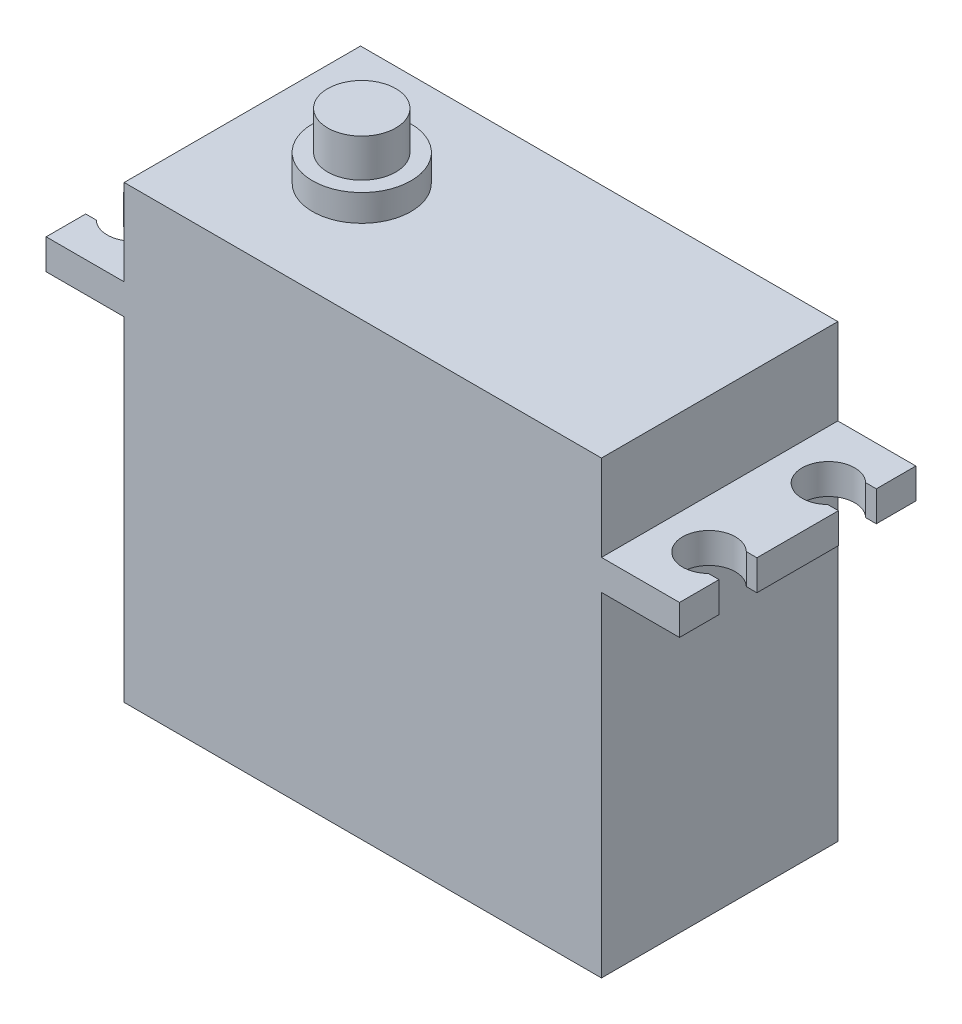
ISO-10303-21;
HEADER;
FILE_DESCRIPTION(('STEP AP214'),'2;1');
FILE_NAME('part.step','',(''),(''),'','','');
FILE_SCHEMA(('AUTOMOTIVE_DESIGN { 1 0 10303 214 1 1 1 1 }'));
ENDSEC;
DATA;
#1=APPLICATION_CONTEXT('core data for automotive mechanical design processes');
#2=APPLICATION_PROTOCOL_DEFINITION('international standard','automotive_design',2000,#1);
#3=PRODUCT_CONTEXT('',#1,'mechanical');
#4=PRODUCT('Part','Part','',(#3));
#5=PRODUCT_RELATED_PRODUCT_CATEGORY('part','',(#4));
#6=PRODUCT_DEFINITION_FORMATION('','',#4);
#7=PRODUCT_DEFINITION_CONTEXT('part definition',#1,'design');
#8=PRODUCT_DEFINITION('design','',#6,#7);
#9=PRODUCT_DEFINITION_SHAPE('','',#8);
#10=(LENGTH_UNIT() NAMED_UNIT(*) SI_UNIT(.MILLI.,.METRE.));
#11=(NAMED_UNIT(*) PLANE_ANGLE_UNIT() SI_UNIT($,.RADIAN.));
#12=(NAMED_UNIT(*) SI_UNIT($,.STERADIAN.) SOLID_ANGLE_UNIT());
#13=UNCERTAINTY_MEASURE_WITH_UNIT(LENGTH_MEASURE(1.E-05),#10,'distance_accuracy_value','');
#14=(GEOMETRIC_REPRESENTATION_CONTEXT(3) GLOBAL_UNCERTAINTY_ASSIGNED_CONTEXT((#13)) GLOBAL_UNIT_ASSIGNED_CONTEXT((#10,
#11,#12)) REPRESENTATION_CONTEXT('',''));
#15=CARTESIAN_POINT('',(0.,0.,0.));
#16=DIRECTION('',(0.,0.,1.));
#17=DIRECTION('',(1.,0.,0.));
#18=AXIS2_PLACEMENT_3D('',#15,#16,#17);
#19=CARTESIAN_POINT('',(40.005,37.7444,0.));
#20=DIRECTION('',(-1.,0.,0.));
#21=DIRECTION('',(0.,0.,1.));
#22=AXIS2_PLACEMENT_3D('',#19,#20,#21);
#23=PLANE('',#22);
#24=DIRECTION('',(0.,0.,-1.));
#25=VECTOR('',#24,1.);
#26=CARTESIAN_POINT('',(40.005,27.9908,0.));
#27=LINE('',#26,#25);
#28=CARTESIAN_POINT('',(40.005,27.9908,0.));
#29=VERTEX_POINT('',#28);
#30=CARTESIAN_POINT('',(40.005,27.9908,-19.812));
#31=VERTEX_POINT('',#30);
#32=EDGE_CURVE('E289',#29,#31,#27,.T.);
#33=ORIENTED_EDGE('',*,*,#32,.F.);
#34=DIRECTION('',(0.,-1.,0.));
#35=VECTOR('',#34,1.);
#36=CARTESIAN_POINT('',(40.005,37.7444,0.));
#37=LINE('',#36,#35);
#38=CARTESIAN_POINT('',(40.005,0.,0.));
#39=VERTEX_POINT('',#38);
#40=EDGE_CURVE('E279',#29,#39,#37,.T.);
#41=ORIENTED_EDGE('',*,*,#40,.T.);
#42=DIRECTION('',(0.,0.,-1.));
#43=VECTOR('',#42,1.);
#44=CARTESIAN_POINT('',(40.005,0.,0.));
#45=LINE('',#44,#43);
#46=CARTESIAN_POINT('',(40.005,0.,-19.812));
#47=VERTEX_POINT('',#46);
#48=EDGE_CURVE('E422',#39,#47,#45,.T.);
#49=ORIENTED_EDGE('',*,*,#48,.T.);
#50=DIRECTION('',(0.,-1.,0.));
#51=VECTOR('',#50,1.);
#52=CARTESIAN_POINT('',(40.005,37.7444,-19.812));
#53=LINE('',#52,#51);
#54=EDGE_CURVE('E433',#31,#47,#53,.T.);
#55=ORIENTED_EDGE('',*,*,#54,.F.);
#56=EDGE_LOOP('',(#33,#41,#49,#55));
#57=FACE_BOUND('',#56,.T.);
#58=ADVANCED_FACE('F37',(#57),#23,.F.);
#59=CARTESIAN_POINT('',(0.,37.7444,0.));
#60=DIRECTION('',(1.,0.,0.));
#61=DIRECTION('',(0.,0.,-1.));
#62=AXIS2_PLACEMENT_3D('',#59,#60,#61);
#63=PLANE('',#62);
#64=DIRECTION('',(0.,0.,1.));
#65=VECTOR('',#64,1.);
#66=CARTESIAN_POINT('',(0.,27.9908,0.));
#67=LINE('',#66,#65);
#68=CARTESIAN_POINT('',(0.,27.9908,-19.812));
#69=VERTEX_POINT('',#68);
#70=CARTESIAN_POINT('',(0.,27.9908,0.));
#71=VERTEX_POINT('',#70);
#72=EDGE_CURVE('E304',#69,#71,#67,.T.);
#73=ORIENTED_EDGE('',*,*,#72,.F.);
#74=DIRECTION('',(0.,-1.,0.));
#75=VECTOR('',#74,1.);
#76=CARTESIAN_POINT('',(0.,37.7444,-19.812));
#77=LINE('',#76,#75);
#78=CARTESIAN_POINT('',(0.,0.,-19.812));
#79=VERTEX_POINT('',#78);
#80=EDGE_CURVE('E329',#69,#79,#77,.T.);
#81=ORIENTED_EDGE('',*,*,#80,.T.);
#82=DIRECTION('',(0.,0.,1.));
#83=VECTOR('',#82,1.);
#84=CARTESIAN_POINT('',(0.,0.,0.));
#85=LINE('',#84,#83);
#86=CARTESIAN_POINT('',(0.,0.,0.));
#87=VERTEX_POINT('',#86);
#88=EDGE_CURVE('E406',#79,#87,#85,.T.);
#89=ORIENTED_EDGE('',*,*,#88,.T.);
#90=DIRECTION('',(0.,-1.,0.));
#91=VECTOR('',#90,1.);
#92=CARTESIAN_POINT('',(0.,37.7444,0.));
#93=LINE('',#92,#91);
#94=EDGE_CURVE('E434',#71,#87,#93,.T.);
#95=ORIENTED_EDGE('',*,*,#94,.F.);
#96=EDGE_LOOP('',(#73,#81,#89,#95));
#97=FACE_BOUND('',#96,.T.);
#98=ADVANCED_FACE('F513',(#97),#63,.F.);
#99=CARTESIAN_POINT('',(10.0076,39.9796,-9.906));
#100=DIRECTION('',(0.,1.,0.));
#101=DIRECTION('',(0.,0.,1.));
#102=AXIS2_PLACEMENT_3D('',#99,#100,#101);
#103=PLANE('',#102);
#104=CARTESIAN_POINT('',(10.0076,39.9796,-9.906));
#105=DIRECTION('',(0.,1.,0.));
#106=DIRECTION('',(0.,0.,1.));
#107=AXIS2_PLACEMENT_3D('',#104,#105,#106);
#108=CIRCLE('',#107,4.1275);
#109=CARTESIAN_POINT('',(10.0076,39.9796,-5.7785));
#110=VERTEX_POINT('',#109);
#111=EDGE_CURVE('E401',#110,#110,#108,.T.);
#112=ORIENTED_EDGE('',*,*,#111,.T.);
#113=EDGE_LOOP('',(#112));
#114=FACE_BOUND('',#113,.T.);
#115=CARTESIAN_POINT('',(10.0076,39.9796,-9.906));
#116=DIRECTION('',(0.,1.,0.));
#117=DIRECTION('',(0.,0.,1.));
#118=AXIS2_PLACEMENT_3D('',#115,#116,#117);
#119=CIRCLE('',#118,2.8575);
#120=CARTESIAN_POINT('',(10.0076,39.9796,-7.0485));
#121=VERTEX_POINT('',#120);
#122=EDGE_CURVE('E380',#121,#121,#119,.T.);
#123=ORIENTED_EDGE('',*,*,#122,.F.);
#124=EDGE_LOOP('',(#123));
#125=FACE_BOUND('',#124,.T.);
#126=ADVANCED_FACE('F587',(#114,#125),#103,.T.);
#127=CARTESIAN_POINT('',(0.,37.7444,0.));
#128=DIRECTION('',(0.,-1.,0.));
#129=DIRECTION('',(0.,0.,-1.));
#130=AXIS2_PLACEMENT_3D('',#127,#128,#129);
#131=PLANE('',#130);
#132=DIRECTION('',(0.,0.,1.));
#133=VECTOR('',#132,1.);
#134=CARTESIAN_POINT('',(0.,37.7444,0.));
#135=LINE('',#134,#133);
#136=CARTESIAN_POINT('',(0.,37.7444,-19.812));
#137=VERTEX_POINT('',#136);
#138=CARTESIAN_POINT('',(0.,37.7444,0.));
#139=VERTEX_POINT('',#138);
#140=EDGE_CURVE('E407',#137,#139,#135,.T.);
#141=ORIENTED_EDGE('',*,*,#140,.T.);
#142=DIRECTION('',(1.,0.,0.));
#143=VECTOR('',#142,1.);
#144=CARTESIAN_POINT('',(0.,37.7444,0.));
#145=LINE('',#144,#143);
#146=CARTESIAN_POINT('',(40.005,37.7444,0.));
#147=VERTEX_POINT('',#146);
#148=EDGE_CURVE('E410',#139,#147,#145,.T.);
#149=ORIENTED_EDGE('',*,*,#148,.T.);
#150=DIRECTION('',(0.,0.,-1.));
#151=VECTOR('',#150,1.);
#152=CARTESIAN_POINT('',(40.005,37.7444,0.));
#153=LINE('',#152,#151);
#154=CARTESIAN_POINT('',(40.005,37.7444,-19.812));
#155=VERTEX_POINT('',#154);
#156=EDGE_CURVE('E413',#147,#155,#153,.T.);
#157=ORIENTED_EDGE('',*,*,#156,.T.);
#158=DIRECTION('',(-1.,0.,0.));
#159=VECTOR('',#158,1.);
#160=CARTESIAN_POINT('',(0.,37.7444,-19.812));
#161=LINE('',#160,#159);
#162=EDGE_CURVE('E415',#155,#137,#161,.T.);
#163=ORIENTED_EDGE('',*,*,#162,.T.);
#164=EDGE_LOOP('',(#141,#149,#157,#163));
#165=FACE_BOUND('',#164,.T.);
#166=CARTESIAN_POINT('',(10.0076,37.7444,-9.906));
#167=DIRECTION('',(0.,-1.,0.));
#168=DIRECTION('',(0.,0.,-1.));
#169=AXIS2_PLACEMENT_3D('',#166,#167,#168);
#170=CIRCLE('',#169,4.1275);
#171=CARTESIAN_POINT('',(10.0076,37.7444,-14.0335));
#172=VERTEX_POINT('',#171);
#173=EDGE_CURVE('E11',#172,#172,#170,.F.);
#174=ORIENTED_EDGE('',*,*,#173,.F.);
#175=EDGE_LOOP('',(#174));
#176=FACE_BOUND('',#175,.T.);
#177=ADVANCED_FACE('F597',(#165,#176),#131,.F.);
#178=CARTESIAN_POINT('',(0.,30.5308,-19.812));
#179=VERTEX_POINT('',#178);
#180=EDGE_CURVE('E430',#137,#179,#77,.T.);
#181=ORIENTED_EDGE('',*,*,#180,.T.);
#182=DIRECTION('',(0.,0.,1.));
#183=VECTOR('',#182,1.);
#184=CARTESIAN_POINT('',(0.,30.5308,0.));
#185=LINE('',#184,#183);
#186=CARTESIAN_POINT('',(0.,30.5308,0.));
#187=VERTEX_POINT('',#186);
#188=EDGE_CURVE('E325',#179,#187,#185,.T.);
#189=ORIENTED_EDGE('',*,*,#188,.T.);
#190=EDGE_CURVE('E46',#139,#187,#93,.T.);
#191=ORIENTED_EDGE('',*,*,#190,.F.);
#192=ORIENTED_EDGE('',*,*,#140,.F.);
#193=EDGE_LOOP('',(#181,#189,#191,#192));
#194=FACE_BOUND('',#193,.T.);
#195=ADVANCED_FACE('F39',(#194),#63,.F.);
#196=CARTESIAN_POINT('',(0.,37.7444,0.));
#197=DIRECTION('',(0.,0.,-1.));
#198=DIRECTION('',(-1.,0.,0.));
#199=AXIS2_PLACEMENT_3D('',#196,#197,#198);
#200=PLANE('',#199);
#201=DIRECTION('',(1.,0.,0.));
#202=VECTOR('',#201,1.);
#203=CARTESIAN_POINT('',(0.,0.,0.));
#204=LINE('',#203,#202);
#205=EDGE_CURVE('E419',#87,#39,#204,.T.);
#206=ORIENTED_EDGE('',*,*,#205,.T.);
#207=ORIENTED_EDGE('',*,*,#40,.F.);
#208=DIRECTION('',(-1.,0.,0.));
#209=VECTOR('',#208,1.);
#210=CARTESIAN_POINT('',(40.005,27.9908,0.));
#211=LINE('',#210,#209);
#212=CARTESIAN_POINT('',(46.5455,27.9908,0.));
#213=VERTEX_POINT('',#212);
#214=EDGE_CURVE('E294',#213,#29,#211,.T.);
#215=ORIENTED_EDGE('',*,*,#214,.F.);
#216=DIRECTION('',(0.,-1.,0.));
#217=VECTOR('',#216,1.);
#218=CARTESIAN_POINT('',(46.5455,30.5308,0.));
#219=LINE('',#218,#217);
#220=CARTESIAN_POINT('',(46.5455,30.5308,0.));
#221=VERTEX_POINT('',#220);
#222=EDGE_CURVE('E309',#221,#213,#219,.T.);
#223=ORIENTED_EDGE('',*,*,#222,.F.);
#224=DIRECTION('',(-1.,0.,0.));
#225=VECTOR('',#224,1.);
#226=CARTESIAN_POINT('',(40.005,30.5308,0.));
#227=LINE('',#226,#225);
#228=CARTESIAN_POINT('',(40.005,30.5308,0.));
#229=VERTEX_POINT('',#228);
#230=EDGE_CURVE('E270',#221,#229,#227,.T.);
#231=ORIENTED_EDGE('',*,*,#230,.T.);
#232=EDGE_CURVE('E437',#147,#229,#37,.T.);
#233=ORIENTED_EDGE('',*,*,#232,.F.);
#234=ORIENTED_EDGE('',*,*,#148,.F.);
#235=ORIENTED_EDGE('',*,*,#190,.T.);
#236=DIRECTION('',(-1.,0.,0.));
#237=VECTOR('',#236,1.);
#238=CARTESIAN_POINT('',(0.,30.5308,0.));
#239=LINE('',#238,#237);
#240=CARTESIAN_POINT('',(-6.5405,30.5308,0.));
#241=VERTEX_POINT('',#240);
#242=EDGE_CURVE('E62',#187,#241,#239,.T.);
#243=ORIENTED_EDGE('',*,*,#242,.T.);
#244=DIRECTION('',(0.,-1.,0.));
#245=VECTOR('',#244,1.);
#246=CARTESIAN_POINT('',(-6.5405,30.5308,0.));
#247=LINE('',#246,#245);
#248=CARTESIAN_POINT('',(-6.5405,27.9908,0.));
#249=VERTEX_POINT('',#248);
#250=EDGE_CURVE('E338',#241,#249,#247,.T.);
#251=ORIENTED_EDGE('',*,*,#250,.T.);
#252=DIRECTION('',(-1.,0.,0.));
#253=VECTOR('',#252,1.);
#254=CARTESIAN_POINT('',(0.,27.9908,0.));
#255=LINE('',#254,#253);
#256=EDGE_CURVE('E345',#71,#249,#255,.T.);
#257=ORIENTED_EDGE('',*,*,#256,.F.);
#258=ORIENTED_EDGE('',*,*,#94,.T.);
#259=EDGE_LOOP('',(#206,#207,#215,#223,#231,#233,#234,#235,#243,#251,#257,#258));
#260=FACE_BOUND('',#259,.T.);
#261=ADVANCED_FACE('F458',(#260),#200,.F.);
#262=ORIENTED_EDGE('',*,*,#232,.T.);
#263=DIRECTION('',(0.,0.,-1.));
#264=VECTOR('',#263,1.);
#265=CARTESIAN_POINT('',(40.005,30.5308,0.));
#266=LINE('',#265,#264);
#267=CARTESIAN_POINT('',(40.005,30.5308,-19.812));
#268=VERTEX_POINT('',#267);
#269=EDGE_CURVE('E276',#229,#268,#266,.T.);
#270=ORIENTED_EDGE('',*,*,#269,.T.);
#271=EDGE_CURVE('E445',#155,#268,#53,.T.);
#272=ORIENTED_EDGE('',*,*,#271,.F.);
#273=ORIENTED_EDGE('',*,*,#156,.F.);
#274=EDGE_LOOP('',(#262,#270,#272,#273));
#275=FACE_BOUND('',#274,.T.);
#276=ADVANCED_FACE('F552',(#275),#23,.F.);
#277=CARTESIAN_POINT('',(0.,37.7444,-19.812));
#278=DIRECTION('',(0.,0.,1.));
#279=DIRECTION('',(1.,0.,0.));
#280=AXIS2_PLACEMENT_3D('',#277,#278,#279);
#281=PLANE('',#280);
#282=DIRECTION('',(-1.,0.,0.));
#283=VECTOR('',#282,1.);
#284=CARTESIAN_POINT('',(0.,0.,-19.812));
#285=LINE('',#284,#283);
#286=EDGE_CURVE('E411',#47,#79,#285,.T.);
#287=ORIENTED_EDGE('',*,*,#286,.T.);
#288=ORIENTED_EDGE('',*,*,#80,.F.);
#289=DIRECTION('',(1.,0.,0.));
#290=VECTOR('',#289,1.);
#291=CARTESIAN_POINT('',(0.,27.9908,-19.812));
#292=LINE('',#291,#290);
#293=CARTESIAN_POINT('',(-6.5405,27.9908,-19.812));
#294=VERTEX_POINT('',#293);
#295=EDGE_CURVE('E328',#294,#69,#292,.T.);
#296=ORIENTED_EDGE('',*,*,#295,.F.);
#297=DIRECTION('',(0.,-1.,0.));
#298=VECTOR('',#297,1.);
#299=CARTESIAN_POINT('',(-6.5405,30.5308,-19.812));
#300=LINE('',#299,#298);
#301=CARTESIAN_POINT('',(-6.5405,30.5308,-19.812));
#302=VERTEX_POINT('',#301);
#303=EDGE_CURVE('E378',#302,#294,#300,.T.);
#304=ORIENTED_EDGE('',*,*,#303,.F.);
#305=DIRECTION('',(1.,0.,0.));
#306=VECTOR('',#305,1.);
#307=CARTESIAN_POINT('',(0.,30.5308,-19.812));
#308=LINE('',#307,#306);
#309=EDGE_CURVE('E335',#302,#179,#308,.T.);
#310=ORIENTED_EDGE('',*,*,#309,.T.);
#311=ORIENTED_EDGE('',*,*,#180,.F.);
#312=ORIENTED_EDGE('',*,*,#162,.F.);
#313=ORIENTED_EDGE('',*,*,#271,.T.);
#314=DIRECTION('',(1.,0.,0.));
#315=VECTOR('',#314,1.);
#316=CARTESIAN_POINT('',(40.005,30.5308,-19.812));
#317=LINE('',#316,#315);
#318=CARTESIAN_POINT('',(46.5455,30.5308,-19.812));
#319=VERTEX_POINT('',#318);
#320=EDGE_CURVE('E54',#268,#319,#317,.T.);
#321=ORIENTED_EDGE('',*,*,#320,.T.);
#322=DIRECTION('',(0.,-1.,0.));
#323=VECTOR('',#322,1.);
#324=CARTESIAN_POINT('',(46.5455,30.5308,-19.812));
#325=LINE('',#324,#323);
#326=CARTESIAN_POINT('',(46.5455,27.9908,-19.812));
#327=VERTEX_POINT('',#326);
#328=EDGE_CURVE('E307',#319,#327,#325,.T.);
#329=ORIENTED_EDGE('',*,*,#328,.T.);
#330=DIRECTION('',(1.,0.,0.));
#331=VECTOR('',#330,1.);
#332=CARTESIAN_POINT('',(40.005,27.9908,-19.812));
#333=LINE('',#332,#331);
#334=EDGE_CURVE('E293',#31,#327,#333,.T.);
#335=ORIENTED_EDGE('',*,*,#334,.F.);
#336=ORIENTED_EDGE('',*,*,#54,.T.);
#337=EDGE_LOOP('',(#287,#288,#296,#304,#310,#311,#312,#313,#321,#329,#335,#336));
#338=FACE_BOUND('',#337,.T.);
#339=ADVANCED_FACE('F508',(#338),#281,.F.);
#340=CARTESIAN_POINT('',(0.,0.,0.));
#341=DIRECTION('',(0.,-1.,0.));
#342=DIRECTION('',(0.,0.,-1.));
#343=AXIS2_PLACEMENT_3D('',#340,#341,#342);
#344=PLANE('',#343);
#345=ORIENTED_EDGE('',*,*,#88,.F.);
#346=ORIENTED_EDGE('',*,*,#286,.F.);
#347=ORIENTED_EDGE('',*,*,#48,.F.);
#348=ORIENTED_EDGE('',*,*,#205,.F.);
#349=EDGE_LOOP('',(#345,#346,#347,#348));
#350=FACE_BOUND('',#349,.T.);
#351=ADVANCED_FACE('F515',(#350),#344,.T.);
#352=CARTESIAN_POINT('',(10.0076,39.9796,-9.906));
#353=DIRECTION('',(0.,-1.,0.));
#354=DIRECTION('',(0.,0.,-1.));
#355=AXIS2_PLACEMENT_3D('',#352,#353,#354);
#356=CYLINDRICAL_SURFACE('',#355,4.1275);
#357=ORIENTED_EDGE('',*,*,#111,.F.);
#358=EDGE_LOOP('',(#357));
#359=FACE_BOUND('',#358,.T.);
#360=ORIENTED_EDGE('',*,*,#173,.T.);
#361=EDGE_LOOP('',(#360));
#362=FACE_BOUND('',#361,.T.);
#363=ADVANCED_FACE('F648',(#359,#362),#356,.T.);
#364=CARTESIAN_POINT('',(10.0076,43.18,-9.906));
#365=DIRECTION('',(0.,-1.,0.));
#366=DIRECTION('',(0.,0.,-1.));
#367=AXIS2_PLACEMENT_3D('',#364,#365,#366);
#368=CYLINDRICAL_SURFACE('',#367,2.8575);
#369=CARTESIAN_POINT('',(10.0076,43.18,-9.906));
#370=DIRECTION('',(0.,1.,0.));
#371=DIRECTION('',(0.,0.,1.));
#372=AXIS2_PLACEMENT_3D('',#369,#370,#371);
#373=CIRCLE('',#372,2.8575);
#374=CARTESIAN_POINT('',(10.0076,43.18,-7.0485));
#375=VERTEX_POINT('',#374);
#376=EDGE_CURVE('E398',#375,#375,#373,.T.);
#377=ORIENTED_EDGE('',*,*,#376,.F.);
#378=EDGE_LOOP('',(#377));
#379=FACE_BOUND('',#378,.T.);
#380=ORIENTED_EDGE('',*,*,#122,.T.);
#381=EDGE_LOOP('',(#380));
#382=FACE_BOUND('',#381,.T.);
#383=ADVANCED_FACE('F626',(#379,#382),#368,.T.);
#384=CARTESIAN_POINT('',(10.0076,43.18,-9.906));
#385=DIRECTION('',(0.,1.,0.));
#386=DIRECTION('',(0.,0.,1.));
#387=AXIS2_PLACEMENT_3D('',#384,#385,#386);
#388=PLANE('',#387);
#389=ORIENTED_EDGE('',*,*,#376,.T.);
#390=EDGE_LOOP('',(#389));
#391=FACE_BOUND('',#390,.T.);
#392=ADVANCED_FACE('F619',(#391),#388,.T.);
#393=CARTESIAN_POINT('',(-6.5405,30.5308,-16.4973));
#394=DIRECTION('',(-1.,0.,0.));
#395=DIRECTION('',(0.,0.,1.));
#396=AXIS2_PLACEMENT_3D('',#393,#394,#395);
#397=PLANE('',#396);
#398=DIRECTION('',(0.,0.,-1.));
#399=VECTOR('',#398,1.);
#400=CARTESIAN_POINT('',(-6.5405,27.9908,-16.4973));
#401=LINE('',#400,#399);
#402=CARTESIAN_POINT('',(-6.5405,27.9908,-16.4973));
#403=VERTEX_POINT('',#402);
#404=EDGE_CURVE('E375',#403,#294,#401,.T.);
#405=ORIENTED_EDGE('',*,*,#404,.F.);
#406=DIRECTION('',(0.,-1.,0.));
#407=VECTOR('',#406,1.);
#408=CARTESIAN_POINT('',(-6.5405,30.5308,-16.4973));
#409=LINE('',#408,#407);
#410=CARTESIAN_POINT('',(-6.5405,30.5308,-16.4973));
#411=VERTEX_POINT('',#410);
#412=EDGE_CURVE('E381',#411,#403,#409,.T.);
#413=ORIENTED_EDGE('',*,*,#412,.F.);
#414=DIRECTION('',(0.,0.,-1.));
#415=VECTOR('',#414,1.);
#416=CARTESIAN_POINT('',(-6.5405,30.5308,-16.4973));
#417=LINE('',#416,#415);
#418=EDGE_CURVE('E339',#411,#302,#417,.T.);
#419=ORIENTED_EDGE('',*,*,#418,.T.);
#420=ORIENTED_EDGE('',*,*,#303,.T.);
#421=EDGE_LOOP('',(#405,#413,#419,#420));
#422=FACE_BOUND('',#421,.T.);
#423=ADVANCED_FACE('F617',(#422),#397,.T.);
#424=CARTESIAN_POINT('',(-6.5405,30.5308,-16.4973));
#425=DIRECTION('',(0.,0.,1.));
#426=DIRECTION('',(1.,0.,0.));
#427=AXIS2_PLACEMENT_3D('',#424,#425,#426);
#428=PLANE('',#427);
#429=DIRECTION('',(-1.,0.,0.));
#430=VECTOR('',#429,1.);
#431=CARTESIAN_POINT('',(-6.5405,27.9908,-16.4973));
#432=LINE('',#431,#430);
#433=CARTESIAN_POINT('',(-5.65202470380879,27.9908,-16.4973));
#434=VERTEX_POINT('',#433);
#435=EDGE_CURVE('E372',#434,#403,#432,.T.);
#436=ORIENTED_EDGE('',*,*,#435,.F.);
#437=DIRECTION('',(0.,-1.,0.));
#438=VECTOR('',#437,1.);
#439=CARTESIAN_POINT('',(-5.65202470380879,30.5308,-16.4973));
#440=LINE('',#439,#438);
#441=CARTESIAN_POINT('',(-5.65202470380879,30.5308,-16.4973));
#442=VERTEX_POINT('',#441);
#443=EDGE_CURVE('E383',#442,#434,#440,.T.);
#444=ORIENTED_EDGE('',*,*,#443,.F.);
#445=DIRECTION('',(-1.,0.,0.));
#446=VECTOR('',#445,1.);
#447=CARTESIAN_POINT('',(-6.5405,30.5308,-16.4973));
#448=LINE('',#447,#446);
#449=EDGE_CURVE('E609',#442,#411,#448,.T.);
#450=ORIENTED_EDGE('',*,*,#449,.T.);
#451=ORIENTED_EDGE('',*,*,#412,.T.);
#452=EDGE_LOOP('',(#436,#444,#450,#451));
#453=FACE_BOUND('',#452,.T.);
#454=ADVANCED_FACE('F502',(#453),#428,.T.);
#455=CARTESIAN_POINT('',(-4.1148,30.5308,-14.9098));
#456=DIRECTION('',(0.,-1.,0.));
#457=DIRECTION('',(0.,0.,-1.));
#458=AXIS2_PLACEMENT_3D('',#455,#456,#457);
#459=CYLINDRICAL_SURFACE('',#458,2.2098);
#460=CARTESIAN_POINT('',(-4.1148,27.9908,-14.9098));
#461=DIRECTION('',(0.,1.,0.));
#462=DIRECTION('',(0.,0.,1.));
#463=AXIS2_PLACEMENT_3D('',#460,#461,#462);
#464=CIRCLE('',#463,2.2098);
#465=CARTESIAN_POINT('',(-5.65202470380879,27.9908,-13.3223));
#466=VERTEX_POINT('',#465);
#467=EDGE_CURVE('E369',#466,#434,#464,.T.);
#468=ORIENTED_EDGE('',*,*,#467,.F.);
#469=DIRECTION('',(0.,-1.,0.));
#470=VECTOR('',#469,1.);
#471=CARTESIAN_POINT('',(-5.65202470380879,30.5308,-13.3223));
#472=LINE('',#471,#470);
#473=CARTESIAN_POINT('',(-5.65202470380879,30.5308,-13.3223));
#474=VERTEX_POINT('',#473);
#475=EDGE_CURVE('E385',#474,#466,#472,.T.);
#476=ORIENTED_EDGE('',*,*,#475,.F.);
#477=CARTESIAN_POINT('',(-4.1148,30.5308,-14.9098));
#478=DIRECTION('',(0.,1.,0.));
#479=DIRECTION('',(0.,0.,1.));
#480=AXIS2_PLACEMENT_3D('',#477,#478,#479);
#481=CIRCLE('',#480,2.2098);
#482=EDGE_CURVE('E498',#474,#442,#481,.T.);
#483=ORIENTED_EDGE('',*,*,#482,.T.);
#484=ORIENTED_EDGE('',*,*,#443,.T.);
#485=EDGE_LOOP('',(#468,#476,#483,#484));
#486=FACE_BOUND('',#485,.T.);
#487=ADVANCED_FACE('F496',(#486),#459,.F.);
#488=CARTESIAN_POINT('',(-6.5405,30.5308,-13.3223));
#489=DIRECTION('',(0.,0.,-1.));
#490=DIRECTION('',(-1.,0.,0.));
#491=AXIS2_PLACEMENT_3D('',#488,#489,#490);
#492=PLANE('',#491);
#493=DIRECTION('',(1.,0.,0.));
#494=VECTOR('',#493,1.);
#495=CARTESIAN_POINT('',(-6.5405,27.9908,-13.3223));
#496=LINE('',#495,#494);
#497=CARTESIAN_POINT('',(-6.5405,27.9908,-13.3223));
#498=VERTEX_POINT('',#497);
#499=EDGE_CURVE('E366',#498,#466,#496,.T.);
#500=ORIENTED_EDGE('',*,*,#499,.F.);
#501=DIRECTION('',(0.,-1.,0.));
#502=VECTOR('',#501,1.);
#503=CARTESIAN_POINT('',(-6.5405,30.5308,-13.3223));
#504=LINE('',#503,#502);
#505=CARTESIAN_POINT('',(-6.5405,30.5308,-13.3223));
#506=VERTEX_POINT('',#505);
#507=EDGE_CURVE('E387',#506,#498,#504,.T.);
#508=ORIENTED_EDGE('',*,*,#507,.F.);
#509=DIRECTION('',(1.,0.,0.));
#510=VECTOR('',#509,1.);
#511=CARTESIAN_POINT('',(-6.5405,30.5308,-13.3223));
#512=LINE('',#511,#510);
#513=EDGE_CURVE('E492',#506,#474,#512,.T.);
#514=ORIENTED_EDGE('',*,*,#513,.T.);
#515=ORIENTED_EDGE('',*,*,#475,.T.);
#516=EDGE_LOOP('',(#500,#508,#514,#515));
#517=FACE_BOUND('',#516,.T.);
#518=ADVANCED_FACE('F489',(#517),#492,.T.);
#519=CARTESIAN_POINT('',(-6.5405,30.5308,-6.48970000000001));
#520=DIRECTION('',(-1.,0.,0.));
#521=DIRECTION('',(0.,0.,1.));
#522=AXIS2_PLACEMENT_3D('',#519,#520,#521);
#523=PLANE('',#522);
#524=DIRECTION('',(0.,0.,-1.));
#525=VECTOR('',#524,1.);
#526=CARTESIAN_POINT('',(-6.5405,27.9908,-6.48970000000001));
#527=LINE('',#526,#525);
#528=CARTESIAN_POINT('',(-6.5405,27.9908,-6.48970000000001));
#529=VERTEX_POINT('',#528);
#530=EDGE_CURVE('E363',#529,#498,#527,.T.);
#531=ORIENTED_EDGE('',*,*,#530,.F.);
#532=DIRECTION('',(0.,-1.,0.));
#533=VECTOR('',#532,1.);
#534=CARTESIAN_POINT('',(-6.5405,30.5308,-6.48970000000001));
#535=LINE('',#534,#533);
#536=CARTESIAN_POINT('',(-6.5405,30.5308,-6.48970000000001));
#537=VERTEX_POINT('',#536);
#538=EDGE_CURVE('E389',#537,#529,#535,.T.);
#539=ORIENTED_EDGE('',*,*,#538,.F.);
#540=DIRECTION('',(0.,0.,-1.));
#541=VECTOR('',#540,1.);
#542=CARTESIAN_POINT('',(-6.5405,30.5308,-6.48970000000001));
#543=LINE('',#542,#541);
#544=EDGE_CURVE('E613',#537,#506,#543,.T.);
#545=ORIENTED_EDGE('',*,*,#544,.T.);
#546=ORIENTED_EDGE('',*,*,#507,.T.);
#547=EDGE_LOOP('',(#531,#539,#545,#546));
#548=FACE_BOUND('',#547,.T.);
#549=ADVANCED_FACE('F485',(#548),#523,.T.);
#550=CARTESIAN_POINT('',(-6.5405,30.5308,-6.48970000000001));
#551=DIRECTION('',(0.,0.,1.));
#552=DIRECTION('',(1.,0.,0.));
#553=AXIS2_PLACEMENT_3D('',#550,#551,#552);
#554=PLANE('',#553);
#555=DIRECTION('',(-1.,0.,0.));
#556=VECTOR('',#555,1.);
#557=CARTESIAN_POINT('',(-6.5405,27.9908,-6.48970000000001));
#558=LINE('',#557,#556);
#559=CARTESIAN_POINT('',(-5.65202470380879,27.9908,-6.4897));
#560=VERTEX_POINT('',#559);
#561=EDGE_CURVE('E360',#560,#529,#558,.T.);
#562=ORIENTED_EDGE('',*,*,#561,.F.);
#563=DIRECTION('',(0.,-1.,0.));
#564=VECTOR('',#563,1.);
#565=CARTESIAN_POINT('',(-5.65202470380879,30.5308,-6.4897));
#566=LINE('',#565,#564);
#567=CARTESIAN_POINT('',(-5.65202470380879,30.5308,-6.4897));
#568=VERTEX_POINT('',#567);
#569=EDGE_CURVE('E391',#568,#560,#566,.T.);
#570=ORIENTED_EDGE('',*,*,#569,.F.);
#571=DIRECTION('',(-1.,0.,0.));
#572=VECTOR('',#571,1.);
#573=CARTESIAN_POINT('',(-6.5405,30.5308,-6.48970000000001));
#574=LINE('',#573,#572);
#575=EDGE_CURVE('E481',#568,#537,#574,.T.);
#576=ORIENTED_EDGE('',*,*,#575,.T.);
#577=ORIENTED_EDGE('',*,*,#538,.T.);
#578=EDGE_LOOP('',(#562,#570,#576,#577));
#579=FACE_BOUND('',#578,.T.);
#580=ADVANCED_FACE('F479',(#579),#554,.T.);
#581=CARTESIAN_POINT('',(-4.1148,30.5308,-4.90220000000001));
#582=DIRECTION('',(0.,-1.,0.));
#583=DIRECTION('',(0.,0.,-1.));
#584=AXIS2_PLACEMENT_3D('',#581,#582,#583);
#585=CYLINDRICAL_SURFACE('',#584,2.2098);
#586=CARTESIAN_POINT('',(-4.1148,27.9908,-4.90220000000001));
#587=DIRECTION('',(0.,1.,0.));
#588=DIRECTION('',(0.,0.,-1.));
#589=AXIS2_PLACEMENT_3D('',#586,#587,#588);
#590=CIRCLE('',#589,2.2098);
#591=CARTESIAN_POINT('',(-5.65202470380879,27.9908,-3.31470000000001));
#592=VERTEX_POINT('',#591);
#593=EDGE_CURVE('E357',#592,#560,#590,.T.);
#594=ORIENTED_EDGE('',*,*,#593,.F.);
#595=DIRECTION('',(0.,-1.,0.));
#596=VECTOR('',#595,1.);
#597=CARTESIAN_POINT('',(-5.65202470380879,30.5308,-3.31470000000001));
#598=LINE('',#597,#596);
#599=CARTESIAN_POINT('',(-5.65202470380879,30.5308,-3.31470000000001));
#600=VERTEX_POINT('',#599);
#601=EDGE_CURVE('E393',#600,#592,#598,.T.);
#602=ORIENTED_EDGE('',*,*,#601,.F.);
#603=CARTESIAN_POINT('',(-4.1148,30.5308,-4.90220000000001));
#604=DIRECTION('',(0.,1.,0.));
#605=DIRECTION('',(0.,0.,-1.));
#606=AXIS2_PLACEMENT_3D('',#603,#604,#605);
#607=CIRCLE('',#606,2.2098);
#608=EDGE_CURVE('E475',#600,#568,#607,.T.);
#609=ORIENTED_EDGE('',*,*,#608,.T.);
#610=ORIENTED_EDGE('',*,*,#569,.T.);
#611=EDGE_LOOP('',(#594,#602,#609,#610));
#612=FACE_BOUND('',#611,.T.);
#613=ADVANCED_FACE('F472',(#612),#585,.F.);
#614=CARTESIAN_POINT('',(-6.5405,30.5308,-3.31470000000001));
#615=DIRECTION('',(0.,0.,-1.));
#616=DIRECTION('',(-1.,0.,0.));
#617=AXIS2_PLACEMENT_3D('',#614,#615,#616);
#618=PLANE('',#617);
#619=DIRECTION('',(1.,0.,0.));
#620=VECTOR('',#619,1.);
#621=CARTESIAN_POINT('',(-6.5405,27.9908,-3.31470000000001));
#622=LINE('',#621,#620);
#623=CARTESIAN_POINT('',(-6.5405,27.9908,-3.31470000000001));
#624=VERTEX_POINT('',#623);
#625=EDGE_CURVE('E354',#624,#592,#622,.T.);
#626=ORIENTED_EDGE('',*,*,#625,.F.);
#627=DIRECTION('',(0.,-1.,0.));
#628=VECTOR('',#627,1.);
#629=CARTESIAN_POINT('',(-6.5405,30.5308,-3.31470000000001));
#630=LINE('',#629,#628);
#631=CARTESIAN_POINT('',(-6.5405,30.5308,-3.31470000000001));
#632=VERTEX_POINT('',#631);
#633=EDGE_CURVE('E395',#632,#624,#630,.T.);
#634=ORIENTED_EDGE('',*,*,#633,.F.);
#635=DIRECTION('',(1.,0.,0.));
#636=VECTOR('',#635,1.);
#637=CARTESIAN_POINT('',(-6.5405,30.5308,-3.31470000000001));
#638=LINE('',#637,#636);
#639=EDGE_CURVE('E616',#632,#600,#638,.T.);
#640=ORIENTED_EDGE('',*,*,#639,.T.);
#641=ORIENTED_EDGE('',*,*,#601,.T.);
#642=EDGE_LOOP('',(#626,#634,#640,#641));
#643=FACE_BOUND('',#642,.T.);
#644=ADVANCED_FACE('F468',(#643),#618,.T.);
#645=CARTESIAN_POINT('',(-6.5405,30.5308,0.));
#646=DIRECTION('',(-1.,0.,0.));
#647=DIRECTION('',(0.,0.,1.));
#648=AXIS2_PLACEMENT_3D('',#645,#646,#647);
#649=PLANE('',#648);
#650=DIRECTION('',(0.,0.,-1.));
#651=VECTOR('',#650,1.);
#652=CARTESIAN_POINT('',(-6.5405,27.9908,0.));
#653=LINE('',#652,#651);
#654=EDGE_CURVE('E351',#249,#624,#653,.T.);
#655=ORIENTED_EDGE('',*,*,#654,.F.);
#656=ORIENTED_EDGE('',*,*,#250,.F.);
#657=DIRECTION('',(0.,0.,-1.));
#658=VECTOR('',#657,1.);
#659=CARTESIAN_POINT('',(-6.5405,30.5308,0.));
#660=LINE('',#659,#658);
#661=EDGE_CURVE('E322',#241,#632,#660,.T.);
#662=ORIENTED_EDGE('',*,*,#661,.T.);
#663=ORIENTED_EDGE('',*,*,#633,.T.);
#664=EDGE_LOOP('',(#655,#656,#662,#663));
#665=FACE_BOUND('',#664,.T.);
#666=ADVANCED_FACE('F463',(#665),#649,.T.);
#667=CARTESIAN_POINT('',(-4.1148,30.5308,-14.9098));
#668=DIRECTION('',(0.,1.,0.));
#669=DIRECTION('',(0.,0.,1.));
#670=AXIS2_PLACEMENT_3D('',#667,#668,#669);
#671=PLANE('',#670);
#672=ORIENTED_EDGE('',*,*,#188,.F.);
#673=ORIENTED_EDGE('',*,*,#309,.F.);
#674=ORIENTED_EDGE('',*,*,#418,.F.);
#675=ORIENTED_EDGE('',*,*,#449,.F.);
#676=ORIENTED_EDGE('',*,*,#482,.F.);
#677=ORIENTED_EDGE('',*,*,#513,.F.);
#678=ORIENTED_EDGE('',*,*,#544,.F.);
#679=ORIENTED_EDGE('',*,*,#575,.F.);
#680=ORIENTED_EDGE('',*,*,#608,.F.);
#681=ORIENTED_EDGE('',*,*,#639,.F.);
#682=ORIENTED_EDGE('',*,*,#661,.F.);
#683=ORIENTED_EDGE('',*,*,#242,.F.);
#684=EDGE_LOOP('',(#672,#673,#674,#675,#676,#677,#678,#679,#680,#681,#682,#683));
#685=FACE_BOUND('',#684,.T.);
#686=ADVANCED_FACE('F608',(#685),#671,.T.);
#687=CARTESIAN_POINT('',(-4.1148,27.9908,-14.9098));
#688=DIRECTION('',(0.,1.,0.));
#689=DIRECTION('',(0.,0.,1.));
#690=AXIS2_PLACEMENT_3D('',#687,#688,#689);
#691=PLANE('',#690);
#692=ORIENTED_EDGE('',*,*,#72,.T.);
#693=ORIENTED_EDGE('',*,*,#256,.T.);
#694=ORIENTED_EDGE('',*,*,#654,.T.);
#695=ORIENTED_EDGE('',*,*,#625,.T.);
#696=ORIENTED_EDGE('',*,*,#593,.T.);
#697=ORIENTED_EDGE('',*,*,#561,.T.);
#698=ORIENTED_EDGE('',*,*,#530,.T.);
#699=ORIENTED_EDGE('',*,*,#499,.T.);
#700=ORIENTED_EDGE('',*,*,#467,.T.);
#701=ORIENTED_EDGE('',*,*,#435,.T.);
#702=ORIENTED_EDGE('',*,*,#404,.T.);
#703=ORIENTED_EDGE('',*,*,#295,.T.);
#704=EDGE_LOOP('',(#692,#693,#694,#695,#696,#697,#698,#699,#700,#701,#702,#703));
#705=FACE_BOUND('',#704,.T.);
#706=ADVANCED_FACE('F453',(#705),#691,.F.);
#707=CARTESIAN_POINT('',(44.1198,30.5308,-14.9098));
#708=DIRECTION('',(0.,-1.,0.));
#709=DIRECTION('',(0.,0.,-1.));
#710=AXIS2_PLACEMENT_3D('',#707,#708,#709);
#711=CYLINDRICAL_SURFACE('',#710,2.2098);
#712=CARTESIAN_POINT('',(44.1198,27.9908,-14.9098));
#713=DIRECTION('',(0.,1.,0.));
#714=DIRECTION('',(0.,0.,-1.));
#715=AXIS2_PLACEMENT_3D('',#712,#713,#714);
#716=CIRCLE('',#715,2.2098);
#717=CARTESIAN_POINT('',(45.6570247038088,27.9908,-16.4973));
#718=VERTEX_POINT('',#717);
#719=CARTESIAN_POINT('',(45.6570247038088,27.9908,-13.3223));
#720=VERTEX_POINT('',#719);
#721=EDGE_CURVE('E541',#718,#720,#716,.T.);
#722=ORIENTED_EDGE('',*,*,#721,.F.);
#723=DIRECTION('',(0.,-1.,0.));
#724=VECTOR('',#723,1.);
#725=CARTESIAN_POINT('',(45.6570247038088,30.5308,-16.4973));
#726=LINE('',#725,#724);
#727=CARTESIAN_POINT('',(45.6570247038088,30.5308,-16.4973));
#728=VERTEX_POINT('',#727);
#729=EDGE_CURVE('E250',#728,#718,#726,.T.);
#730=ORIENTED_EDGE('',*,*,#729,.F.);
#731=CARTESIAN_POINT('',(44.1198,30.5308,-14.9098));
#732=DIRECTION('',(0.,1.,0.));
#733=DIRECTION('',(0.,0.,-1.));
#734=AXIS2_PLACEMENT_3D('',#731,#732,#733);
#735=CIRCLE('',#734,2.2098);
#736=CARTESIAN_POINT('',(45.6570247038088,30.5308,-13.3223));
#737=VERTEX_POINT('',#736);
#738=EDGE_CURVE('E243',#728,#737,#735,.T.);
#739=ORIENTED_EDGE('',*,*,#738,.T.);
#740=DIRECTION('',(0.,-1.,0.));
#741=VECTOR('',#740,1.);
#742=CARTESIAN_POINT('',(45.6570247038088,30.5308,-13.3223));
#743=LINE('',#742,#741);
#744=EDGE_CURVE('E226',#737,#720,#743,.T.);
#745=ORIENTED_EDGE('',*,*,#744,.T.);
#746=EDGE_LOOP('',(#722,#730,#739,#745));
#747=FACE_BOUND('',#746,.T.);
#748=ADVANCED_FACE('F249',(#747),#711,.F.);
#749=CARTESIAN_POINT('',(46.5455,30.5308,-16.4973));
#750=DIRECTION('',(0.,0.,1.));
#751=DIRECTION('',(1.,0.,0.));
#752=AXIS2_PLACEMENT_3D('',#749,#750,#751);
#753=PLANE('',#752);
#754=DIRECTION('',(-1.,0.,0.));
#755=VECTOR('',#754,1.);
#756=CARTESIAN_POINT('',(46.5455,27.9908,-16.4973));
#757=LINE('',#756,#755);
#758=CARTESIAN_POINT('',(46.5455,27.9908,-16.4973));
#759=VERTEX_POINT('',#758);
#760=EDGE_CURVE('E251',#759,#718,#757,.T.);
#761=ORIENTED_EDGE('',*,*,#760,.F.);
#762=DIRECTION('',(0.,-1.,0.));
#763=VECTOR('',#762,1.);
#764=CARTESIAN_POINT('',(46.5455,30.5308,-16.4973));
#765=LINE('',#764,#763);
#766=CARTESIAN_POINT('',(46.5455,30.5308,-16.4973));
#767=VERTEX_POINT('',#766);
#768=EDGE_CURVE('E305',#767,#759,#765,.T.);
#769=ORIENTED_EDGE('',*,*,#768,.F.);
#770=DIRECTION('',(-1.,0.,0.));
#771=VECTOR('',#770,1.);
#772=CARTESIAN_POINT('',(46.5455,30.5308,-16.4973));
#773=LINE('',#772,#771);
#774=EDGE_CURVE('E237',#767,#728,#773,.T.);
#775=ORIENTED_EDGE('',*,*,#774,.T.);
#776=ORIENTED_EDGE('',*,*,#729,.T.);
#777=EDGE_LOOP('',(#761,#769,#775,#776));
#778=FACE_BOUND('',#777,.T.);
#779=ADVANCED_FACE('F572',(#778),#753,.T.);
#780=CARTESIAN_POINT('',(46.5455,30.5308,-16.4973));
#781=DIRECTION('',(1.,0.,0.));
#782=DIRECTION('',(0.,0.,-1.));
#783=AXIS2_PLACEMENT_3D('',#780,#781,#782);
#784=PLANE('',#783);
#785=DIRECTION('',(0.,0.,1.));
#786=VECTOR('',#785,1.);
#787=CARTESIAN_POINT('',(46.5455,27.9908,-16.4973));
#788=LINE('',#787,#786);
#789=EDGE_CURVE('E254',#327,#759,#788,.T.);
#790=ORIENTED_EDGE('',*,*,#789,.F.);
#791=ORIENTED_EDGE('',*,*,#328,.F.);
#792=DIRECTION('',(0.,0.,1.));
#793=VECTOR('',#792,1.);
#794=CARTESIAN_POINT('',(46.5455,30.5308,-16.4973));
#795=LINE('',#794,#793);
#796=EDGE_CURVE('E273',#319,#767,#795,.T.);
#797=ORIENTED_EDGE('',*,*,#796,.T.);
#798=ORIENTED_EDGE('',*,*,#768,.T.);
#799=EDGE_LOOP('',(#790,#791,#797,#798));
#800=FACE_BOUND('',#799,.T.);
#801=ADVANCED_FACE('F546',(#800),#784,.T.);
#802=CARTESIAN_POINT('',(46.5455,30.5308,0.));
#803=DIRECTION('',(1.,0.,0.));
#804=DIRECTION('',(0.,0.,-1.));
#805=AXIS2_PLACEMENT_3D('',#802,#803,#804);
#806=PLANE('',#805);
#807=DIRECTION('',(0.,0.,1.));
#808=VECTOR('',#807,1.);
#809=CARTESIAN_POINT('',(46.5455,27.9908,0.));
#810=LINE('',#809,#808);
#811=CARTESIAN_POINT('',(46.5455,27.9908,-3.31470000000001));
#812=VERTEX_POINT('',#811);
#813=EDGE_CURVE('E299',#812,#213,#810,.T.);
#814=ORIENTED_EDGE('',*,*,#813,.F.);
#815=DIRECTION('',(0.,-1.,0.));
#816=VECTOR('',#815,1.);
#817=CARTESIAN_POINT('',(46.5455,30.5308,-3.31470000000001));
#818=LINE('',#817,#816);
#819=CARTESIAN_POINT('',(46.5455,30.5308,-3.31470000000001));
#820=VERTEX_POINT('',#819);
#821=EDGE_CURVE('E311',#820,#812,#818,.T.);
#822=ORIENTED_EDGE('',*,*,#821,.F.);
#823=DIRECTION('',(0.,0.,1.));
#824=VECTOR('',#823,1.);
#825=CARTESIAN_POINT('',(46.5455,30.5308,0.));
#826=LINE('',#825,#824);
#827=EDGE_CURVE('E267',#820,#221,#826,.T.);
#828=ORIENTED_EDGE('',*,*,#827,.T.);
#829=ORIENTED_EDGE('',*,*,#222,.T.);
#830=EDGE_LOOP('',(#814,#822,#828,#829));
#831=FACE_BOUND('',#830,.T.);
#832=ADVANCED_FACE('F557',(#831),#806,.T.);
#833=CARTESIAN_POINT('',(46.5455,30.5308,-3.31470000000001));
#834=DIRECTION('',(0.,0.,-1.));
#835=DIRECTION('',(-1.,0.,0.));
#836=AXIS2_PLACEMENT_3D('',#833,#834,#835);
#837=PLANE('',#836);
#838=DIRECTION('',(1.,0.,0.));
#839=VECTOR('',#838,1.);
#840=CARTESIAN_POINT('',(46.5455,27.9908,-3.31470000000001));
#841=LINE('',#840,#839);
#842=CARTESIAN_POINT('',(45.6570247038088,27.9908,-3.31470000000001));
#843=VERTEX_POINT('',#842);
#844=EDGE_CURVE('E528',#843,#812,#841,.T.);
#845=ORIENTED_EDGE('',*,*,#844,.F.);
#846=DIRECTION('',(0.,-1.,0.));
#847=VECTOR('',#846,1.);
#848=CARTESIAN_POINT('',(45.6570247038088,30.5308,-3.31470000000001));
#849=LINE('',#848,#847);
#850=CARTESIAN_POINT('',(45.6570247038088,30.5308,-3.31470000000001));
#851=VERTEX_POINT('',#850);
#852=EDGE_CURVE('E313',#851,#843,#849,.T.);
#853=ORIENTED_EDGE('',*,*,#852,.F.);
#854=DIRECTION('',(1.,0.,0.));
#855=VECTOR('',#854,1.);
#856=CARTESIAN_POINT('',(46.5455,30.5308,-3.31470000000001));
#857=LINE('',#856,#855);
#858=EDGE_CURVE('E264',#851,#820,#857,.T.);
#859=ORIENTED_EDGE('',*,*,#858,.T.);
#860=ORIENTED_EDGE('',*,*,#821,.T.);
#861=EDGE_LOOP('',(#845,#853,#859,#860));
#862=FACE_BOUND('',#861,.T.);
#863=ADVANCED_FACE('F561',(#862),#837,.T.);
#864=CARTESIAN_POINT('',(44.1198,30.5308,-4.90220000000001));
#865=DIRECTION('',(0.,-1.,0.));
#866=DIRECTION('',(0.,0.,-1.));
#867=AXIS2_PLACEMENT_3D('',#864,#865,#866);
#868=CYLINDRICAL_SURFACE('',#867,2.2098);
#869=CARTESIAN_POINT('',(44.1198,27.9908,-4.90220000000001));
#870=DIRECTION('',(0.,1.,0.));
#871=DIRECTION('',(0.,0.,1.));
#872=AXIS2_PLACEMENT_3D('',#869,#870,#871);
#873=CIRCLE('',#872,2.2098);
#874=CARTESIAN_POINT('',(45.6570247038088,27.9908,-6.4897));
#875=VERTEX_POINT('',#874);
#876=EDGE_CURVE('E529',#875,#843,#873,.T.);
#877=ORIENTED_EDGE('',*,*,#876,.F.);
#878=DIRECTION('',(0.,-1.,0.));
#879=VECTOR('',#878,1.);
#880=CARTESIAN_POINT('',(45.6570247038088,30.5308,-6.4897));
#881=LINE('',#880,#879);
#882=CARTESIAN_POINT('',(45.6570247038088,30.5308,-6.4897));
#883=VERTEX_POINT('',#882);
#884=EDGE_CURVE('E315',#883,#875,#881,.T.);
#885=ORIENTED_EDGE('',*,*,#884,.F.);
#886=CARTESIAN_POINT('',(44.1198,30.5308,-4.90220000000001));
#887=DIRECTION('',(0.,1.,0.));
#888=DIRECTION('',(0.,0.,1.));
#889=AXIS2_PLACEMENT_3D('',#886,#887,#888);
#890=CIRCLE('',#889,2.2098);
#891=EDGE_CURVE('E261',#883,#851,#890,.T.);
#892=ORIENTED_EDGE('',*,*,#891,.T.);
#893=ORIENTED_EDGE('',*,*,#852,.T.);
#894=EDGE_LOOP('',(#877,#885,#892,#893));
#895=FACE_BOUND('',#894,.T.);
#896=ADVANCED_FACE('F564',(#895),#868,.F.);
#897=CARTESIAN_POINT('',(46.5455,30.5308,-6.48970000000001));
#898=DIRECTION('',(0.,0.,1.));
#899=DIRECTION('',(1.,0.,0.));
#900=AXIS2_PLACEMENT_3D('',#897,#898,#899);
#901=PLANE('',#900);
#902=DIRECTION('',(-1.,0.,0.));
#903=VECTOR('',#902,1.);
#904=CARTESIAN_POINT('',(46.5455,27.9908,-6.48970000000001));
#905=LINE('',#904,#903);
#906=CARTESIAN_POINT('',(46.5455,27.9908,-6.48970000000001));
#907=VERTEX_POINT('',#906);
#908=EDGE_CURVE('E532',#907,#875,#905,.T.);
#909=ORIENTED_EDGE('',*,*,#908,.F.);
#910=DIRECTION('',(0.,-1.,0.));
#911=VECTOR('',#910,1.);
#912=CARTESIAN_POINT('',(46.5455,30.5308,-6.48970000000001));
#913=LINE('',#912,#911);
#914=CARTESIAN_POINT('',(46.5455,30.5308,-6.48970000000001));
#915=VERTEX_POINT('',#914);
#916=EDGE_CURVE('E317',#915,#907,#913,.T.);
#917=ORIENTED_EDGE('',*,*,#916,.F.);
#918=DIRECTION('',(-1.,0.,0.));
#919=VECTOR('',#918,1.);
#920=CARTESIAN_POINT('',(46.5455,30.5308,-6.48970000000001));
#921=LINE('',#920,#919);
#922=EDGE_CURVE('E258',#915,#883,#921,.T.);
#923=ORIENTED_EDGE('',*,*,#922,.T.);
#924=ORIENTED_EDGE('',*,*,#884,.T.);
#925=EDGE_LOOP('',(#909,#917,#923,#924));
#926=FACE_BOUND('',#925,.T.);
#927=ADVANCED_FACE('F567',(#926),#901,.T.);
#928=CARTESIAN_POINT('',(46.5455,30.5308,-6.48970000000001));
#929=DIRECTION('',(1.,0.,0.));
#930=DIRECTION('',(0.,0.,-1.));
#931=AXIS2_PLACEMENT_3D('',#928,#929,#930);
#932=PLANE('',#931);
#933=DIRECTION('',(0.,0.,1.));
#934=VECTOR('',#933,1.);
#935=CARTESIAN_POINT('',(46.5455,27.9908,-6.48970000000001));
#936=LINE('',#935,#934);
#937=CARTESIAN_POINT('',(46.5455,27.9908,-13.3223));
#938=VERTEX_POINT('',#937);
#939=EDGE_CURVE('E537',#938,#907,#936,.T.);
#940=ORIENTED_EDGE('',*,*,#939,.F.);
#941=DIRECTION('',(0.,-1.,0.));
#942=VECTOR('',#941,1.);
#943=CARTESIAN_POINT('',(46.5455,30.5308,-13.3223));
#944=LINE('',#943,#942);
#945=CARTESIAN_POINT('',(46.5455,30.5308,-13.3223));
#946=VERTEX_POINT('',#945);
#947=EDGE_CURVE('E236',#946,#938,#944,.T.);
#948=ORIENTED_EDGE('',*,*,#947,.F.);
#949=DIRECTION('',(0.,0.,1.));
#950=VECTOR('',#949,1.);
#951=CARTESIAN_POINT('',(46.5455,30.5308,-6.48970000000001));
#952=LINE('',#951,#950);
#953=EDGE_CURVE('E247',#946,#915,#952,.T.);
#954=ORIENTED_EDGE('',*,*,#953,.T.);
#955=ORIENTED_EDGE('',*,*,#916,.T.);
#956=EDGE_LOOP('',(#940,#948,#954,#955));
#957=FACE_BOUND('',#956,.T.);
#958=ADVANCED_FACE('F570',(#957),#932,.T.);
#959=CARTESIAN_POINT('',(46.5455,30.5308,-13.3223));
#960=DIRECTION('',(0.,0.,-1.));
#961=DIRECTION('',(-1.,0.,0.));
#962=AXIS2_PLACEMENT_3D('',#959,#960,#961);
#963=PLANE('',#962);
#964=DIRECTION('',(1.,0.,0.));
#965=VECTOR('',#964,1.);
#966=CARTESIAN_POINT('',(46.5455,27.9908,-13.3223));
#967=LINE('',#966,#965);
#968=EDGE_CURVE('E231',#720,#938,#967,.T.);
#969=ORIENTED_EDGE('',*,*,#968,.F.);
#970=ORIENTED_EDGE('',*,*,#744,.F.);
#971=DIRECTION('',(1.,0.,0.));
#972=VECTOR('',#971,1.);
#973=CARTESIAN_POINT('',(46.5455,30.5308,-13.3223));
#974=LINE('',#973,#972);
#975=EDGE_CURVE('E229',#737,#946,#974,.T.);
#976=ORIENTED_EDGE('',*,*,#975,.T.);
#977=ORIENTED_EDGE('',*,*,#947,.T.);
#978=EDGE_LOOP('',(#969,#970,#976,#977));
#979=FACE_BOUND('',#978,.T.);
#980=ADVANCED_FACE('F228',(#979),#963,.T.);
#981=CARTESIAN_POINT('',(44.1198,30.5308,-14.9098));
#982=DIRECTION('',(0.,-1.,0.));
#983=DIRECTION('',(0.,0.,-1.));
#984=AXIS2_PLACEMENT_3D('',#981,#982,#983);
#985=PLANE('',#984);
#986=ORIENTED_EDGE('',*,*,#738,.F.);
#987=ORIENTED_EDGE('',*,*,#774,.F.);
#988=ORIENTED_EDGE('',*,*,#796,.F.);
#989=ORIENTED_EDGE('',*,*,#320,.F.);
#990=ORIENTED_EDGE('',*,*,#269,.F.);
#991=ORIENTED_EDGE('',*,*,#230,.F.);
#992=ORIENTED_EDGE('',*,*,#827,.F.);
#993=ORIENTED_EDGE('',*,*,#858,.F.);
#994=ORIENTED_EDGE('',*,*,#891,.F.);
#995=ORIENTED_EDGE('',*,*,#922,.F.);
#996=ORIENTED_EDGE('',*,*,#953,.F.);
#997=ORIENTED_EDGE('',*,*,#975,.F.);
#998=EDGE_LOOP('',(#986,#987,#988,#989,#990,#991,#992,#993,#994,#995,#996,#997));
#999=FACE_BOUND('',#998,.T.);
#1000=ADVANCED_FACE('F241',(#999),#985,.F.);
#1001=CARTESIAN_POINT('',(44.1198,27.9908,-14.9098));
#1002=DIRECTION('',(0.,-1.,0.));
#1003=DIRECTION('',(0.,0.,-1.));
#1004=AXIS2_PLACEMENT_3D('',#1001,#1002,#1003);
#1005=PLANE('',#1004);
#1006=ORIENTED_EDGE('',*,*,#721,.T.);
#1007=ORIENTED_EDGE('',*,*,#968,.T.);
#1008=ORIENTED_EDGE('',*,*,#939,.T.);
#1009=ORIENTED_EDGE('',*,*,#908,.T.);
#1010=ORIENTED_EDGE('',*,*,#876,.T.);
#1011=ORIENTED_EDGE('',*,*,#844,.T.);
#1012=ORIENTED_EDGE('',*,*,#813,.T.);
#1013=ORIENTED_EDGE('',*,*,#214,.T.);
#1014=ORIENTED_EDGE('',*,*,#32,.T.);
#1015=ORIENTED_EDGE('',*,*,#334,.T.);
#1016=ORIENTED_EDGE('',*,*,#789,.T.);
#1017=ORIENTED_EDGE('',*,*,#760,.T.);
#1018=EDGE_LOOP('',(#1006,#1007,#1008,#1009,#1010,#1011,#1012,#1013,#1014,#1015,#1016,#1017));
#1019=FACE_BOUND('',#1018,.T.);
#1020=ADVANCED_FACE('F525',(#1019),#1005,.T.);
#1021=CLOSED_SHELL('',(#58,#98,#126,#177,#195,#261,#276,#339,#351,#363,#383,#392,#423,#454,#487,
#518,#549,#580,#613,#644,#666,#686,#706,#748,#779,#801,#832,#863,#896,#927,#958,#980,#1000,#1020));
#1022=MANIFOLD_SOLID_BREP('B2',#1021);
#1023=ADVANCED_BREP_SHAPE_REPRESENTATION('',(#18,#1022),#14);
#1024=SHAPE_DEFINITION_REPRESENTATION(#9,#1023);
ENDSEC;
END-ISO-10303-21;
